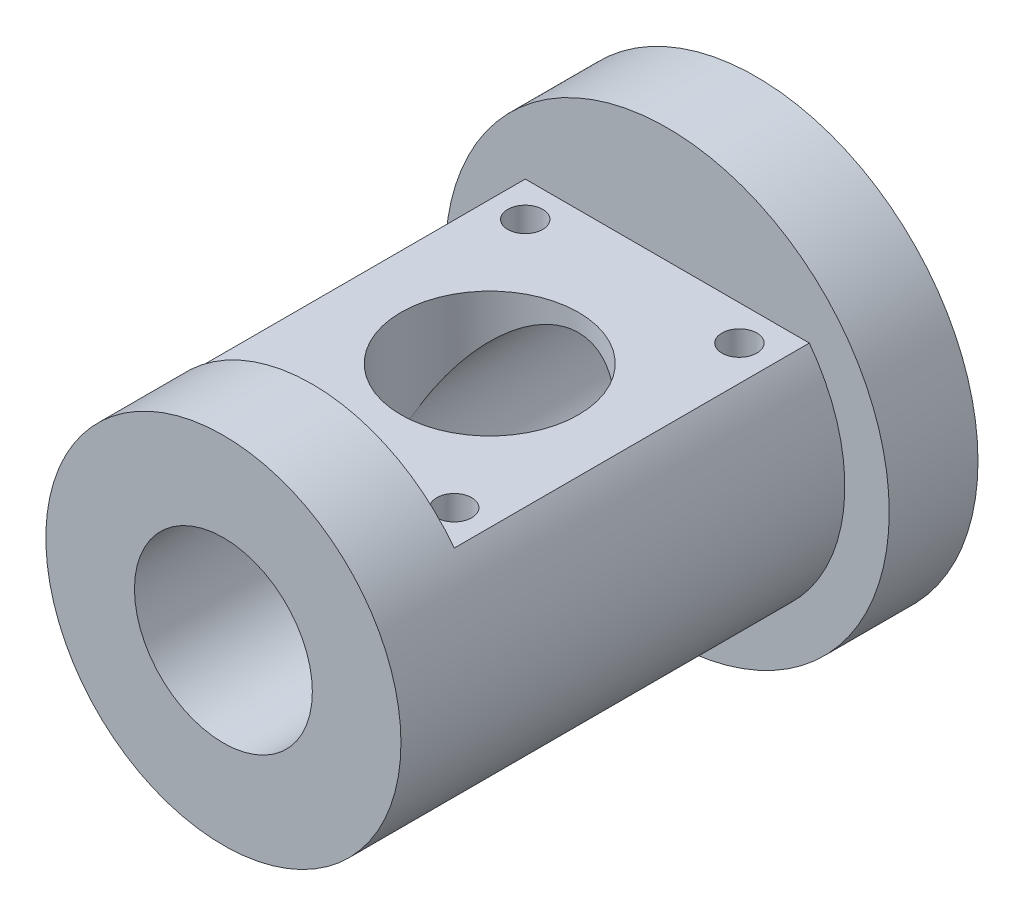
ISO-10303-21;
HEADER;
FILE_DESCRIPTION(('STEP AP214'),'2;1');
FILE_NAME('part.step','',(''),(''),'','','');
FILE_SCHEMA(('AUTOMOTIVE_DESIGN { 1 0 10303 214 1 1 1 1 }'));
ENDSEC;
DATA;
#1=APPLICATION_CONTEXT('core data for automotive mechanical design processes');
#2=APPLICATION_PROTOCOL_DEFINITION('international standard','automotive_design',2000,#1);
#3=PRODUCT_CONTEXT('',#1,'mechanical');
#4=PRODUCT('Part','Part','',(#3));
#5=PRODUCT_RELATED_PRODUCT_CATEGORY('part','',(#4));
#6=PRODUCT_DEFINITION_FORMATION('','',#4);
#7=PRODUCT_DEFINITION_CONTEXT('part definition',#1,'design');
#8=PRODUCT_DEFINITION('design','',#6,#7);
#9=PRODUCT_DEFINITION_SHAPE('','',#8);
#10=(LENGTH_UNIT() NAMED_UNIT(*) SI_UNIT(.MILLI.,.METRE.));
#11=(NAMED_UNIT(*) PLANE_ANGLE_UNIT() SI_UNIT($,.RADIAN.));
#12=(NAMED_UNIT(*) SI_UNIT($,.STERADIAN.) SOLID_ANGLE_UNIT());
#13=UNCERTAINTY_MEASURE_WITH_UNIT(LENGTH_MEASURE(1.E-05),#10,'distance_accuracy_value','');
#14=(GEOMETRIC_REPRESENTATION_CONTEXT(3) GLOBAL_UNCERTAINTY_ASSIGNED_CONTEXT((#13)) GLOBAL_UNIT_ASSIGNED_CONTEXT((#10,
#11,#12)) REPRESENTATION_CONTEXT('',''));
#15=CARTESIAN_POINT('',(0.,0.,0.));
#16=DIRECTION('',(0.,0.,1.));
#17=DIRECTION('',(1.,0.,0.));
#18=AXIS2_PLACEMENT_3D('',#15,#16,#17);
#19=CARTESIAN_POINT('',(0.,0.,76.2));
#20=DIRECTION('',(0.,0.,-1.));
#21=DIRECTION('',(-1.,0.,0.));
#22=AXIS2_PLACEMENT_3D('',#19,#20,#21);
#23=CYLINDRICAL_SURFACE('',#22,25.4);
#24=CARTESIAN_POINT('',(0.,0.,76.2));
#25=DIRECTION('',(0.,0.,1.));
#26=DIRECTION('',(1.,0.,0.));
#27=AXIS2_PLACEMENT_3D('',#24,#25,#26);
#28=CIRCLE('',#27,25.4);
#29=CARTESIAN_POINT('',(25.4,0.,76.2));
#30=VERTEX_POINT('',#29);
#31=EDGE_CURVE('E220',#30,#30,#28,.T.);
#32=ORIENTED_EDGE('',*,*,#31,.F.);
#33=EDGE_LOOP('',(#32));
#34=FACE_BOUND('',#33,.T.);
#35=DIRECTION('',(0.,0.,-1.));
#36=VECTOR('',#35,1.);
#37=CARTESIAN_POINT('',(20.32,15.24,76.2));
#38=LINE('',#37,#36);
#39=CARTESIAN_POINT('',(20.32,15.24,12.7000000000001));
#40=VERTEX_POINT('',#39);
#41=CARTESIAN_POINT('',(20.32,15.24,63.4999999999999));
#42=VERTEX_POINT('',#41);
#43=EDGE_CURVE('E81',#40,#42,#38,.F.);
#44=ORIENTED_EDGE('',*,*,#43,.T.);
#45=CARTESIAN_POINT('',(0.,0.,63.4999999999999));
#46=DIRECTION('',(0.,0.,1.));
#47=DIRECTION('',(1.,0.,0.));
#48=AXIS2_PLACEMENT_3D('',#45,#46,#47);
#49=CIRCLE('',#48,25.4);
#50=CARTESIAN_POINT('',(-20.32,15.24,63.4999999999999));
#51=VERTEX_POINT('',#50);
#52=EDGE_CURVE('E13',#42,#51,#49,.T.);
#53=ORIENTED_EDGE('',*,*,#52,.T.);
#54=DIRECTION('',(0.,0.,-1.));
#55=VECTOR('',#54,1.);
#56=CARTESIAN_POINT('',(-20.32,15.24,76.2));
#57=LINE('',#56,#55);
#58=CARTESIAN_POINT('',(-20.32,15.24,12.7000000000001));
#59=VERTEX_POINT('',#58);
#60=EDGE_CURVE('E73',#51,#59,#57,.T.);
#61=ORIENTED_EDGE('',*,*,#60,.T.);
#62=CARTESIAN_POINT('',(0.,0.,12.7));
#63=DIRECTION('',(0.,0.,-1.));
#64=DIRECTION('',(-1.,0.,0.));
#65=AXIS2_PLACEMENT_3D('',#62,#63,#64);
#66=CIRCLE('',#65,25.4);
#67=EDGE_CURVE('E56',#40,#59,#66,.T.);
#68=ORIENTED_EDGE('',*,*,#67,.F.);
#69=EDGE_LOOP('',(#44,#53,#61,#68));
#70=FACE_BOUND('',#69,.T.);
#71=ADVANCED_FACE('F48',(#34,#70),#23,.T.);
#72=CARTESIAN_POINT('',(0.,0.,76.2));
#73=DIRECTION('',(0.,0.,-1.));
#74=DIRECTION('',(-1.,0.,0.));
#75=AXIS2_PLACEMENT_3D('',#72,#73,#74);
#76=CYLINDRICAL_SURFACE('',#75,12.7254);
#77=CARTESIAN_POINT('',(0.,0.,76.2));
#78=DIRECTION('',(0.,0.,1.));
#79=DIRECTION('',(1.,0.,0.));
#80=AXIS2_PLACEMENT_3D('',#77,#78,#79);
#81=CIRCLE('',#80,12.7254);
#82=CARTESIAN_POINT('',(12.7254,0.,76.2));
#83=VERTEX_POINT('',#82);
#84=EDGE_CURVE('E223',#83,#83,#81,.T.);
#85=ORIENTED_EDGE('',*,*,#84,.T.);
#86=EDGE_LOOP('',(#85));
#87=FACE_BOUND('',#86,.T.);
#88=CARTESIAN_POINT('',(0.,0.,0.));
#89=DIRECTION('',(0.,0.,1.));
#90=DIRECTION('',(1.,0.,0.));
#91=AXIS2_PLACEMENT_3D('',#88,#89,#90);
#92=CIRCLE('',#91,12.7254);
#93=CARTESIAN_POINT('',(12.7254,0.,0.));
#94=VERTEX_POINT('',#93);
#95=EDGE_CURVE('E226',#94,#94,#92,.T.);
#96=ORIENTED_EDGE('',*,*,#95,.F.);
#97=EDGE_LOOP('',(#96));
#98=FACE_BOUND('',#97,.T.);
#99=CARTESIAN_POINT('',(0.,12.7254,25.4));
#100=CARTESIAN_POINT('',(0.283503075217503,12.7253982735124,25.4000017269695));
#101=CARTESIAN_POINT('',(0.567031583878415,12.7159066586084,25.4095122847607));
#102=CARTESIAN_POINT('',(1.13158187092593,12.6781464440053,25.4473483608033));
#103=CARTESIAN_POINT('',(1.41260333746254,12.6498755404723,25.4756761875479));
#104=CARTESIAN_POINT('',(1.96992789090204,12.5751458305134,25.5505580527036));
#105=CARTESIAN_POINT('',(2.24622780434996,12.5286752575441,25.5971238824429));
#106=CARTESIAN_POINT('',(2.79181837703421,12.4184951494227,25.7075333668689));
#107=CARTESIAN_POINT('',(3.06110907436359,12.3547857079802,25.7713769276347));
#108=CARTESIAN_POINT('',(3.58915925229374,12.211800441902,25.9146692007291));
#109=CARTESIAN_POINT('',(3.84797742891022,12.1326323071431,25.9940099560901));
#110=CARTESIAN_POINT('',(4.35565078473388,11.9597670082414,26.167261206221));
#111=CARTESIAN_POINT('',(4.60450617664447,11.8660701544921,26.2611713897276));
#112=CARTESIAN_POINT('',(5.09132901837167,11.6654831413864,26.4622279218859));
#113=CARTESIAN_POINT('',(5.32929490840019,11.5585911000383,26.5693761586451));
#114=CARTESIAN_POINT('',(5.79368760178478,11.3329462168841,26.7955792805922));
#115=CARTESIAN_POINT('',(6.0201116969907,11.214190610599,26.9146369409536));
#116=CARTESIAN_POINT('',(6.5512105600019,10.9153319753728,27.214283268275));
#117=CARTESIAN_POINT('',(6.85000736184145,10.7300054291769,27.4001200068268));
#118=CARTESIAN_POINT('',(7.42342907541239,10.3415923501045,27.7896678968642));
#119=CARTESIAN_POINT('',(7.6980455550405,10.1384996706951,27.9933852345668));
#120=CARTESIAN_POINT('',(8.22368877972578,9.7170183744352,28.4162540764933));
#121=CARTESIAN_POINT('',(8.47466848948848,9.49860070801112,28.635434897413));
#122=CARTESIAN_POINT('',(8.95285712117012,9.04929868062149,29.0864334034598));
#123=CARTESIAN_POINT('',(9.18006601137517,8.81841430302406,29.3182511054457));
#124=CARTESIAN_POINT('',(9.69471784883543,8.25498702554692,29.8841640748558));
#125=CARTESIAN_POINT('',(9.97151962476572,7.91763026258839,30.2231730605859));
#126=CARTESIAN_POINT('',(10.4825681019403,7.22745197465379,30.9172686672075));
#127=CARTESIAN_POINT('',(10.7167945354973,6.87462318301227,31.2723628453862));
#128=CARTESIAN_POINT('',(11.1443228340372,6.15744372921262,31.9950601737473));
#129=CARTESIAN_POINT('',(11.3376316022273,5.79309502251653,32.3626612017366));
#130=CARTESIAN_POINT('',(11.6848642560927,5.0562323878155,33.1077216347447));
#131=CARTESIAN_POINT('',(11.8388063812709,4.68372232833369,33.4851763846333));
#132=CARTESIAN_POINT('',(12.0580267024218,4.07452784431645,34.1052652385187));
#133=CARTESIAN_POINT('',(12.1348991611845,3.83932836596991,34.3453410186967));
#134=CARTESIAN_POINT('',(12.2738783150885,3.36863968249421,34.828167511851));
#135=CARTESIAN_POINT('',(12.3360240586132,3.13315294618359,35.0709093238844));
#136=CARTESIAN_POINT('',(12.4319133450767,2.7231546435206,35.4976261079061));
#137=CARTESIAN_POINT('',(12.4688545321908,2.54847561657312,35.6807268130746));
#138=CARTESIAN_POINT('',(12.5184578287738,2.28734366484906,35.9582487028599));
#139=CARTESIAN_POINT('',(12.5340599812219,2.20020237778568,36.0515021894253));
#140=CARTESIAN_POINT('',(12.5632679719949,2.02677648456196,36.2390055620241));
#141=CARTESIAN_POINT('',(12.576875082303,1.94049136554264,36.3332547717515));
#142=CARTESIAN_POINT('',(12.6021916746324,1.76866194293028,36.5239024562783));
#143=CARTESIAN_POINT('',(12.6138870101864,1.68312723688796,36.6203114348558));
#144=CARTESIAN_POINT('',(12.635276926227,1.51420619273081,36.8156841119073));
#145=CARTESIAN_POINT('',(12.6449664941349,1.43082568212602,36.9146535317131));
#146=CARTESIAN_POINT('',(12.6621883779505,1.26938416159401,37.1155740107605));
#147=CARTESIAN_POINT('',(12.6697384214044,1.19128378212676,37.2174923623163));
#148=CARTESIAN_POINT('',(12.6826500228597,1.04469988257344,37.4280303980356));
#149=CARTESIAN_POINT('',(12.6880233308356,0.976166074864932,37.5366103583696));
#150=CARTESIAN_POINT('',(12.6939919089333,0.893936939290402,37.7057244302322));
#151=CARTESIAN_POINT('',(12.6956103028364,0.870425919367278,37.7612319370542));
#152=CARTESIAN_POINT('',(12.6981362523195,0.832764184171217,37.8751757970996));
#153=CARTESIAN_POINT('',(12.6990483922416,0.818553196669688,37.9335905967143));
#154=CARTESIAN_POINT('',(12.6999522587792,0.804402763331838,38.0408042890113));
#155=CARTESIAN_POINT('',(12.7000870999248,0.802246741481132,38.0892955762355));
#156=CARTESIAN_POINT('',(12.6998015633158,0.806751869208341,38.1859102066779));
#157=CARTESIAN_POINT('',(12.6993803534266,0.813426233557754,38.2340328897962));
#158=CARTESIAN_POINT('',(12.6977680427335,0.838264623438727,38.3470189302518));
#159=CARTESIAN_POINT('',(12.6963404924988,0.859898119017429,38.4110795110424));
#160=CARTESIAN_POINT('',(12.6926862156968,0.912259749449805,38.5354612615749));
#161=CARTESIAN_POINT('',(12.6904550009985,0.94303878587681,38.5957591540054));
#162=CARTESIAN_POINT('',(12.6828969429109,1.04118374100145,38.7687845865987));
#163=CARTESIAN_POINT('',(12.6766356373534,1.11566909245363,38.8772998399882));
#164=CARTESIAN_POINT('',(12.661898891451,1.272193900205,39.0886750743317));
#165=CARTESIAN_POINT('',(12.6534161728792,1.35425760314715,39.1915150944999));
#166=CARTESIAN_POINT('',(12.6342737674974,1.52253890685937,39.3944307584393));
#167=CARTESIAN_POINT('',(12.6236034179358,1.60877520955755,39.4944900274932));
#168=CARTESIAN_POINT('',(12.6001638124911,1.78309555228272,39.6924091662657));
#169=CARTESIAN_POINT('',(12.5873979856684,1.87117637183011,39.7902723371443));
#170=CARTESIAN_POINT('',(12.5460622456827,2.13634637288551,40.0810647174425));
#171=CARTESIAN_POINT('',(12.514372410057,2.31509664377341,40.2720443055038));
#172=CARTESIAN_POINT('',(12.4426290874838,2.67402120678351,40.65109831594));
#173=CARTESIAN_POINT('',(12.4025742284215,2.85419572785466,40.8391722562591));
#174=CARTESIAN_POINT('',(12.3139864475366,3.21497629222656,41.2133168217211));
#175=CARTESIAN_POINT('',(12.2654442255399,3.39558259228463,41.3993850090861));
#176=CARTESIAN_POINT('',(12.159829893858,3.75628463573771,41.7695449095842));
#177=CARTESIAN_POINT('',(12.1027582792705,3.93638040814897,41.9536367367729));
#178=CARTESIAN_POINT('',(11.9188281497951,4.47446424195692,42.5022979300458));
#179=CARTESIAN_POINT('',(11.7790661736377,4.83102319020137,42.864050369837));
#180=CARTESIAN_POINT('',(11.4641354485133,5.53704311691462,43.5786825862194));
#181=CARTESIAN_POINT('',(11.2889797123005,5.88650665224524,43.9315655702677));
#182=CARTESIAN_POINT('',(10.9001572582412,6.57886273380067,44.6297536794355));
#183=CARTESIAN_POINT('',(10.6861556149274,6.92166691794363,44.9749610276522));
#184=CARTESIAN_POINT('',(10.2191156478804,7.59428479322121,45.6517376047582));
#185=CARTESIAN_POINT('',(9.96606636651715,7.92409480519059,45.9833029722226));
#186=CARTESIAN_POINT('',(9.41977234953498,8.56628051614034,46.6285603469664));
#187=CARTESIAN_POINT('',(9.12659082357491,8.87868256556129,46.9422793841533));
#188=CARTESIAN_POINT('',(8.49829876342923,9.48177733960151,47.5476978520094));
#189=CARTESIAN_POINT('',(8.16321706587893,9.77248477730847,47.8394122075289));
#190=CARTESIAN_POINT('',(7.58662245146991,10.2204037948798,48.2887700330917));
#191=CARTESIAN_POINT('',(7.35835221094552,10.3861407530189,48.4550115012856));
#192=CARTESIAN_POINT('',(6.88538804212682,10.70554206866,48.7753442638901));
#193=CARTESIAN_POINT('',(6.64069608947361,10.8592078735912,48.9294370150385));
#194=CARTESIAN_POINT('',(6.13537896805742,11.1524964423885,49.2235105372261));
#195=CARTESIAN_POINT('',(5.87477200854999,11.2921347891677,49.3635069680902));
#196=CARTESIAN_POINT('',(5.3379394424204,11.5555855034477,49.6276119585766));
#197=CARTESIAN_POINT('',(5.06171594570916,11.6794000015334,49.7517226571195));
#198=CARTESIAN_POINT('',(4.53913661289714,11.8911142631278,49.9639300790254));
#199=CARTESIAN_POINT('',(4.2948816904205,11.9816016885515,50.0546227419708));
#200=CARTESIAN_POINT('',(3.79696960554564,12.148569534534,50.2219622030627));
#201=CARTESIAN_POINT('',(3.54331426947897,12.225052658901,50.2986117125202));
#202=CARTESIAN_POINT('',(3.02791501608873,12.3627932482251,50.4366475222624));
#203=CARTESIAN_POINT('',(2.76617376542742,12.4240556738171,50.4980387954182));
#204=CARTESIAN_POINT('',(2.23612450188734,12.5303073251625,50.604511516645));
#205=CARTESIAN_POINT('',(1.96781643482729,12.5752964166001,50.6495928300978));
#206=CARTESIAN_POINT('',(1.4251980506364,12.6483170264759,50.7227621349421));
#207=CARTESIAN_POINT('',(1.15086435833772,12.676262256035,50.7507636556109));
#208=CARTESIAN_POINT('',(0.599713704816765,12.7142615094336,50.7888392703393));
#209=CARTESIAN_POINT('',(0.3228967383441,12.7243154954367,50.7989133264859));
#210=CARTESIAN_POINT('',(-0.230829579139542,12.7263179795671,50.8009198154658));
#211=CARTESIAN_POINT('',(-0.507738912411422,12.718268945767,50.7928547212977));
#212=CARTESIAN_POINT('',(-1.05932638827814,12.6842413038889,50.7587587647089));
#213=CARTESIAN_POINT('',(-1.33400462331233,12.6582634425155,50.7327286505001));
#214=CARTESIAN_POINT('',(-1.85668521513405,12.5917507173774,50.666080735556));
#215=CARTESIAN_POINT('',(-2.10503747298518,12.5525744907347,50.6268244191294));
#216=CARTESIAN_POINT('',(-2.59642790698065,12.4602111182584,50.5342697732623));
#217=CARTESIAN_POINT('',(-2.8394665493885,12.4070252071455,50.4809726812825));
#218=CARTESIAN_POINT('',(-3.31897715797931,12.2874436422606,50.3611370317289));
#219=CARTESIAN_POINT('',(-3.55544774933242,12.221045246236,50.2945957253162));
#220=CARTESIAN_POINT('',(-4.02072679493476,12.075966914226,50.1491989299276));
#221=CARTESIAN_POINT('',(-4.24953377041495,11.9972846243377,50.0703410807912));
#222=CARTESIAN_POINT('',(-4.77138728164633,11.801291398918,49.8739004018208));
#223=CARTESIAN_POINT('',(-5.06123992673702,11.6797228096465,49.7520471327658));
#224=CARTESIAN_POINT('',(-5.62468243252594,11.4190711850423,49.4907622308708));
#225=CARTESIAN_POINT('',(-5.89826804486557,11.2799836037032,49.3513260354233));
#226=CARTESIAN_POINT('',(-6.42873245427022,10.9863200743392,49.0568944885944));
#227=CARTESIAN_POINT('',(-6.68558903799763,10.8317241986041,48.901879117937));
#228=CARTESIAN_POINT('',(-7.18187685388694,10.5092366602926,48.5784730816961));
#229=CARTESIAN_POINT('',(-7.42130716414225,10.3413442952683,48.4100817094626));
#230=CARTESIAN_POINT('',(-7.96597845457128,9.93143306393022,47.99888429144));
#231=CARTESIAN_POINT('',(-8.26382102197971,9.68451388704073,47.7511389045923));
#232=CARTESIAN_POINT('',(-8.82782829027731,9.17334241971672,47.2381006714978));
#233=CARTESIAN_POINT('',(-9.09398201052793,8.90908416996058,46.972801791969));
#234=CARTESIAN_POINT('',(-9.59594516456664,8.36603791991254,46.4273907245614));
#235=CARTESIAN_POINT('',(-9.8316967272197,8.087223588136,46.1472516768294));
#236=CARTESIAN_POINT('',(-10.2732942392052,7.51830616766651,45.5752912297833));
#237=CARTESIAN_POINT('',(-10.4791404026717,7.22820315982364,45.2834699141376));
#238=CARTESIAN_POINT('',(-10.9314339630109,6.53212831494173,44.5826815854777));
#239=CARTESIAN_POINT('',(-11.1655722690426,6.12225587453933,44.1695769072696));
#240=CARTESIAN_POINT('',(-11.4784123713883,5.49872411556746,43.5397620081392));
#241=CARTESIAN_POINT('',(-11.5763249392687,5.28935276681995,43.328056097792));
#242=CARTESIAN_POINT('',(-11.7596228688783,4.86824343240146,42.9015769914166));
#243=CARTESIAN_POINT('',(-11.8450087923617,4.65650555331548,42.6868039334082));
#244=CARTESIAN_POINT('',(-12.0032998719442,4.23176732255097,42.254944981861));
#245=CARTESIAN_POINT('',(-12.0762320675568,4.0187707722341,42.0378652147415));
#246=CARTESIAN_POINT('',(-12.2100488987021,3.59173364965076,41.6009893291556));
#247=CARTESIAN_POINT('',(-12.2709323643066,3.37769297806599,41.3811929491062));
#248=CARTESIAN_POINT('',(-12.3807855614068,2.94970964353661,40.9386766022907));
#249=CARTESIAN_POINT('',(-12.4297583264222,2.73576696951732,40.7159573951976));
#250=CARTESIAN_POINT('',(-12.5159211804403,2.30965617555279,40.2666228529354));
#251=CARTESIAN_POINT('',(-12.5531143372513,2.09748760760766,40.0400085484166));
#252=CARTESIAN_POINT('',(-12.6006308425488,1.78098267962673,39.6901294923564));
#253=CARTESIAN_POINT('',(-12.6152573064685,1.6740411613819,39.5697911674991));
#254=CARTESIAN_POINT('',(-12.6413350785041,1.46407323717637,39.3254900651843));
#255=CARTESIAN_POINT('',(-12.6527893230182,1.36104328719562,39.2015307578467));
#256=CARTESIAN_POINT('',(-12.6683755269201,1.20477722919609,38.9988293192608));
#257=CARTESIAN_POINT('',(-12.6735794732673,1.14852315053622,38.9225126414798));
#258=CARTESIAN_POINT('',(-12.682789932327,1.04185380406188,38.7656172484729));
#259=CARTESIAN_POINT('',(-12.686796400563,0.991438753162282,38.6850383750719));
#260=CARTESIAN_POINT('',(-12.6921552387412,0.919660368212738,38.5493023224672));
#261=CARTESIAN_POINT('',(-12.6939368167992,0.894556452710382,38.4961940071092));
#262=CARTESIAN_POINT('',(-12.6968728378033,0.851870126447791,38.387022786461));
#263=CARTESIAN_POINT('',(-12.6980291333091,0.834265530297703,38.3309691549154));
#264=CARTESIAN_POINT('',(-12.6994449152297,0.812408243813588,38.2274112034527));
#265=CARTESIAN_POINT('',(-12.6998339691585,0.806240878289567,38.1803319443149));
#266=CARTESIAN_POINT('',(-12.7000796923722,0.802363056819035,38.0858949645333));
#267=CARTESIAN_POINT('',(-12.699937391235,0.804636246017999,38.0385379597433));
#268=CARTESIAN_POINT('',(-12.6990455598978,0.818596806274729,37.933891080325));
#269=CARTESIAN_POINT('',(-12.6981606703461,0.832378990769851,37.876894158931));
#270=CARTESIAN_POINT('',(-12.6957213255317,0.868790546310741,37.7656495764018));
#271=CARTESIAN_POINT('',(-12.6941628382066,0.891473117272873,37.7114207054224));
#272=CARTESIAN_POINT('',(-12.6886932472706,0.967122743820459,37.554045187962));
#273=CARTESIAN_POINT('',(-12.6839715883906,1.02801989374566,37.4548960239521));
#274=CARTESIAN_POINT('',(-12.6727234747594,1.15858417553525,37.2625335254469));
#275=CARTESIAN_POINT('',(-12.6661883798605,1.22829239983979,37.169351303934));
#276=CARTESIAN_POINT('',(-12.6513490544642,1.37276879543249,36.9855817861409));
#277=CARTESIAN_POINT('',(-12.64302756324,1.44758109301365,36.8950303659019));
#278=CARTESIAN_POINT('',(-12.6247221652512,1.59939186366176,36.7163746912599));
#279=CARTESIAN_POINT('',(-12.6147423195919,1.67638462402622,36.6282650576188));
#280=CARTESIAN_POINT('',(-12.5826260421702,1.90713004009198,36.3686126737063));
#281=CARTESIAN_POINT('',(-12.5580930470455,2.06284402174891,36.1991063664595));
#282=CARTESIAN_POINT('',(-12.5025867614062,2.37624915345355,35.862980209469));
#283=CARTESIAN_POINT('',(-12.4716122155551,2.53394068325082,35.6963609292191));
#284=CARTESIAN_POINT('',(-12.4031439667533,2.8502700791444,35.3649130673059));
#285=CARTESIAN_POINT('',(-12.3656412264923,3.00890895877292,35.2000873090917));
#286=CARTESIAN_POINT('',(-12.2841019637976,3.32618230426962,34.8720941006063));
#287=CARTESIAN_POINT('',(-12.2400659349102,3.48481676956667,34.7089265260643));
#288=CARTESIAN_POINT('',(-12.0986426342027,3.9581067199435,34.2236639845684));
#289=CARTESIAN_POINT('',(-11.9915123016658,4.27214292661769,33.9037386138866));
#290=CARTESIAN_POINT('',(-11.7506254110194,4.89596033548371,33.2701383586729));
#291=CARTESIAN_POINT('',(-11.616881025093,5.20574341389784,32.9564606885819));
#292=CARTESIAN_POINT('',(-11.3211149184249,5.82111318397531,32.3344446681256));
#293=CARTESIAN_POINT('',(-11.1589364577743,6.12666591897702,32.0261469114347));
#294=CARTESIAN_POINT('',(-10.8058725861039,6.72986488501374,31.4181812651292));
#295=CARTESIAN_POINT('',(-10.6149818009314,7.02750962359289,31.1185150036293));
#296=CARTESIAN_POINT('',(-10.2032690209524,7.61297033835204,30.5294943121854));
#297=CARTESIAN_POINT('',(-9.98241590689301,7.90077570088769,30.2401510037189));
#298=CARTESIAN_POINT('',(-9.5098722197607,8.46363459246762,29.6745579758794));
#299=CARTESIAN_POINT('',(-9.25818949830713,8.73869134380599,29.3983049474542));
#300=CARTESIAN_POINT('',(-8.77946095625681,9.2166076306294,28.9184747801541));
#301=CARTESIAN_POINT('',(-8.5584275272173,9.42245195821292,28.7118651102871));
#302=CARTESIAN_POINT('',(-8.09608215086896,9.8225611107359,28.3103532822664));
#303=CARTESIAN_POINT('',(-7.85477046947059,10.0168260874593,28.1154509706506));
#304=CARTESIAN_POINT('',(-7.35191049346628,10.3915073781641,27.7396023790111));
#305=CARTESIAN_POINT('',(-7.09038456593196,10.5719385709045,27.5586411038392));
#306=CARTESIAN_POINT('',(-6.54696585646184,10.9168002039709,27.2128108003395));
#307=CARTESIAN_POINT('',(-6.26507957784482,11.0812357144546,27.0479366728114));
#308=CARTESIAN_POINT('',(-5.73829800997159,11.3612749429665,26.7671784990981));
#309=CARTESIAN_POINT('',(-5.49689081364674,11.4801518412724,26.6480070816926));
#310=CARTESIAN_POINT('',(-5.00185892223017,11.7043143952062,26.4233039362142));
#311=CARTESIAN_POINT('',(-4.74824084222974,11.8096072985188,26.3177649345846));
#312=CARTESIAN_POINT('',(-4.22977720214966,12.0050607167997,26.1218648654398));
#313=CARTESIAN_POINT('',(-3.96494009989707,12.0952323857724,26.0314926103098));
#314=CARTESIAN_POINT('',(-3.42517973743326,12.2590146656976,25.8673525034709));
#315=CARTESIAN_POINT('',(-3.1502580410353,12.332627831848,25.7935820898756));
#316=CARTESIAN_POINT('',(-2.63986997139382,12.4508350276368,25.6751257641726));
#317=CARTESIAN_POINT('',(-2.40570329044821,12.498239338232,25.6276229901671));
#318=CARTESIAN_POINT('',(-1.93287025587601,12.5800381191425,25.5456556986213));
#319=CARTESIAN_POINT('',(-1.69420453106564,12.6144343935994,25.5111893729985));
#320=CARTESIAN_POINT('',(-1.21376284588202,12.6696900005532,25.4558217882085));
#321=CARTESIAN_POINT('',(-0.971987139923301,12.6905504332683,25.4349194265374));
#322=CARTESIAN_POINT('',(-0.486814004922121,12.7184070397057,25.4070069237667));
#323=CARTESIAN_POINT('',(-0.243416377200543,12.7254014823661,25.3999985172201));
#324=CARTESIAN_POINT('',(0.,12.7254,25.4));
#325=B_SPLINE_CURVE_WITH_KNOTS('',3,(#99,#100,#101,#102,#103,#104,#105,#106,#107,#108,#109,#110,
#111,#112,#113,#114,#115,#116,#117,#118,#119,#120,#121,#122,#123,#124,#125,#126,#127,#128,#129,
#130,#131,#132,#133,#134,#135,#136,#137,#138,#139,#140,#141,#142,#143,#144,#145,#146,#147,#148,
#149,#150,#151,#152,#153,#154,#155,#156,#157,#158,#159,#160,#161,#162,#163,#164,#165,#166,#167,
#168,#169,#170,#171,#172,#173,#174,#175,#176,#177,#178,#179,#180,#181,#182,#183,#184,#185,#186,
#187,#188,#189,#190,#191,#192,#193,#194,#195,#196,#197,#198,#199,#200,#201,#202,#203,#204,#205,
#206,#207,#208,#209,#210,#211,#212,#213,#214,#215,#216,#217,#218,#219,#220,#221,#222,#223,#224,
#225,#226,#227,#228,#229,#230,#231,#232,#233,#234,#235,#236,#237,#238,#239,#240,#241,#242,#243,
#244,#245,#246,#247,#248,#249,#250,#251,#252,#253,#254,#255,#256,#257,#258,#259,#260,#261,#262,
#263,#264,#265,#266,#267,#268,#269,#270,#271,#272,#273,#274,#275,#276,#277,#278,#279,#280,#281,
#282,#283,#284,#285,#286,#287,#288,#289,#290,#291,#292,#293,#294,#295,#296,#297,#298,#299,#300,
#301,#302,#303,#304,#305,#306,#307,#308,#309,#310,#311,#312,#313,#314,#315,#316,#317,#318,#319,
#320,#321,#322,#323,#324),.UNSPECIFIED.,.T.,.F.,(4,2,2,2,2,2,2,2,2,2,2,2,2,2,2,2,2,2,2,2,2,2,2,
2,2,2,2,2,2,2,2,2,2,2,2,2,2,2,2,2,2,2,2,2,2,2,2,2,2,2,2,2,2,2,2,2,2,2,2,2,2,2,2,2,2,2,2,2,2,2,2,
2,2,2,2,2,2,2,2,2,2,2,2,2,2,2,2,2,2,2,2,2,2,2,2,2,2,2,2,2,2,2,2,2,2,2,2,2,2,2,2,2,4),(0.,
0.850238617712459,1.70058156154875,2.55147518344615,3.40236418001712,4.24752449013905,
5.09266674662855,5.93792968290453,6.7833900460451,7.97469144872915,9.16640664735569,
10.3604452597039,11.5544854650616,13.2098220216419,14.8659445373171,16.5217874259626,
18.1768617274583,19.2108760793714,20.2421172365912,21.0091994078198,21.3949275387387,
21.780408660637,22.1686243702412,22.5577988522306,22.9436475780948,23.3273848203628,
23.5077940257586,23.6870221305142,23.8318320570311,23.9768589385324,24.1785311294884,
24.3813474959829,24.775530832237,25.1710221883739,25.5684891068581,25.9653119744873,
26.7555888479751,27.5459954525481,28.337273649699,29.1285059340975,30.7075952847021,
32.2861051253405,33.8789338386954,35.4722103505974,37.0630056690404,38.6527121308607,
39.6342759066286,40.6157218047105,41.5960650826054,42.5762762238609,43.4029135486536,
44.229391106038,45.0555989486423,45.8818136103975,46.7121772042606,47.5425425541754,
48.3727947032046,49.2030122757607,49.9655808134954,50.7280821659716,51.4907419410599,
52.2535480407282,53.2633967643696,54.2735080757888,55.2849343944483,56.2964141820181,
57.6725962108689,59.0492537271044,60.4284942287543,61.8077248540297,63.6866416471575,
64.6267475275445,65.5668112362273,66.5048071858138,67.4428941699025,68.3807419831412,
69.3183453478667,69.803267805968,70.2877398786658,70.5724939310752,70.8572585584626,
71.0332308114489,71.2086788046513,71.3504385178765,71.4919236936325,71.6667938423606,
71.8427255596126,72.190626164015,72.5402136814659,72.8933446552356,73.245623265933,
73.9398704591236,74.6342530749804,75.3296047176473,76.0249038578532,77.4067960678183,
78.7880577032571,80.1771875970588,81.5665778218351,82.9574222927607,84.3479132799475,
85.4449150410854,86.5419024193889,87.637692894757,88.7331348974123,89.6152271021687,
90.4968467065351,91.3778131061883,92.2586434675671,92.9887297727415,93.7187147818707,
94.4486404490405,95.178657236057),.UNSPECIFIED.);
#326=CARTESIAN_POINT('',(0.,12.7254,25.4));
#327=VERTEX_POINT('',#326);
#328=EDGE_CURVE('E80',#327,#327,#325,.T.);
#329=ORIENTED_EDGE('',*,*,#328,.F.);
#330=EDGE_LOOP('',(#329));
#331=FACE_BOUND('',#330,.T.);
#332=ADVANCED_FACE('F50',(#87,#98,#331),#76,.F.);
#333=CARTESIAN_POINT('',(0.,0.,76.2));
#334=DIRECTION('',(0.,0.,1.));
#335=DIRECTION('',(1.,0.,0.));
#336=AXIS2_PLACEMENT_3D('',#333,#334,#335);
#337=PLANE('',#336);
#338=ORIENTED_EDGE('',*,*,#84,.F.);
#339=EDGE_LOOP('',(#338));
#340=FACE_BOUND('',#339,.T.);
#341=ORIENTED_EDGE('',*,*,#31,.T.);
#342=EDGE_LOOP('',(#341));
#343=FACE_BOUND('',#342,.T.);
#344=ADVANCED_FACE('F196',(#340,#343),#337,.T.);
#345=CARTESIAN_POINT('',(0.,0.,0.));
#346=DIRECTION('',(0.,0.,1.));
#347=DIRECTION('',(1.,0.,0.));
#348=AXIS2_PLACEMENT_3D('',#345,#346,#347);
#349=PLANE('',#348);
#350=CARTESIAN_POINT('',(0.,25.4,0.));
#351=DIRECTION('',(0.,0.,-1.));
#352=DIRECTION('',(-1.,0.,0.));
#353=AXIS2_PLACEMENT_3D('',#350,#351,#352);
#354=CIRCLE('',#353,2.665);
#355=CARTESIAN_POINT('',(-2.665,25.4,0.));
#356=VERTEX_POINT('',#355);
#357=EDGE_CURVE('E244',#356,#356,#354,.T.);
#358=ORIENTED_EDGE('',*,*,#357,.F.);
#359=EDGE_LOOP('',(#358));
#360=FACE_BOUND('',#359,.T.);
#361=CARTESIAN_POINT('',(21.9970452561244,12.6999999999994,0.));
#362=DIRECTION('',(0.,0.,-1.));
#363=DIRECTION('',(-1.,0.,0.));
#364=AXIS2_PLACEMENT_3D('',#361,#362,#363);
#365=CIRCLE('',#364,2.66500000000083);
#366=CARTESIAN_POINT('',(19.3320452561236,12.6999999999994,0.));
#367=VERTEX_POINT('',#366);
#368=EDGE_CURVE('E272',#367,#367,#365,.T.);
#369=ORIENTED_EDGE('',*,*,#368,.F.);
#370=EDGE_LOOP('',(#369));
#371=FACE_BOUND('',#370,.T.);
#372=CARTESIAN_POINT('',(21.9970452561237,-12.7000000000006,0.));
#373=DIRECTION('',(0.,0.,-1.));
#374=DIRECTION('',(-1.,0.,0.));
#375=AXIS2_PLACEMENT_3D('',#372,#373,#374);
#376=CIRCLE('',#375,2.66500000000145);
#377=CARTESIAN_POINT('',(19.3320452561222,-12.7000000000006,0.));
#378=VERTEX_POINT('',#377);
#379=EDGE_CURVE('E247',#378,#378,#376,.T.);
#380=ORIENTED_EDGE('',*,*,#379,.F.);
#381=EDGE_LOOP('',(#380));
#382=FACE_BOUND('',#381,.T.);
#383=CARTESIAN_POINT('',(-1.4432899320127E-12,-25.4,0.));
#384=DIRECTION('',(0.,0.,-1.));
#385=DIRECTION('',(-1.,0.,0.));
#386=AXIS2_PLACEMENT_3D('',#383,#384,#385);
#387=CIRCLE('',#386,2.66500000000154);
#388=CARTESIAN_POINT('',(-2.66500000000299,-25.4,0.));
#389=VERTEX_POINT('',#388);
#390=EDGE_CURVE('E254',#389,#389,#387,.T.);
#391=ORIENTED_EDGE('',*,*,#390,.F.);
#392=EDGE_LOOP('',(#391));
#393=FACE_BOUND('',#392,.T.);
#394=CARTESIAN_POINT('',(-21.9970452561258,-12.6999999999994,0.));
#395=DIRECTION('',(0.,0.,-1.));
#396=DIRECTION('',(-1.,0.,0.));
#397=AXIS2_PLACEMENT_3D('',#394,#395,#396);
#398=CIRCLE('',#397,2.66500000000096);
#399=CARTESIAN_POINT('',(-24.6620452561268,-12.6999999999994,0.));
#400=VERTEX_POINT('',#399);
#401=EDGE_CURVE('E260',#400,#400,#398,.T.);
#402=ORIENTED_EDGE('',*,*,#401,.F.);
#403=EDGE_LOOP('',(#402));
#404=FACE_BOUND('',#403,.T.);
#405=CARTESIAN_POINT('',(-21.9970452561251,12.7000000000006,0.));
#406=DIRECTION('',(0.,0.,-1.));
#407=DIRECTION('',(-1.,0.,0.));
#408=AXIS2_PLACEMENT_3D('',#405,#406,#407);
#409=CIRCLE('',#408,2.66500000000022);
#410=CARTESIAN_POINT('',(-24.6620452561253,12.7000000000006,0.));
#411=VERTEX_POINT('',#410);
#412=EDGE_CURVE('E266',#411,#411,#409,.T.);
#413=ORIENTED_EDGE('',*,*,#412,.F.);
#414=EDGE_LOOP('',(#413));
#415=FACE_BOUND('',#414,.T.);
#416=ORIENTED_EDGE('',*,*,#95,.T.);
#417=EDGE_LOOP('',(#416));
#418=FACE_BOUND('',#417,.T.);
#419=CARTESIAN_POINT('',(0.,0.,0.));
#420=DIRECTION('',(0.,0.,-1.));
#421=DIRECTION('',(-1.,0.,0.));
#422=AXIS2_PLACEMENT_3D('',#419,#420,#421);
#423=CIRCLE('',#422,31.75);
#424=CARTESIAN_POINT('',(-31.75,0.,0.));
#425=VERTEX_POINT('',#424);
#426=EDGE_CURVE('E96',#425,#425,#423,.T.);
#427=ORIENTED_EDGE('',*,*,#426,.T.);
#428=EDGE_LOOP('',(#427));
#429=FACE_BOUND('',#428,.T.);
#430=ADVANCED_FACE('F200',(#360,#371,#382,#393,#404,#415,#418,#429),#349,.F.);
#431=CARTESIAN_POINT('',(0.,0.,12.7));
#432=DIRECTION('',(0.,0.,-1.));
#433=DIRECTION('',(-1.,0.,0.));
#434=AXIS2_PLACEMENT_3D('',#431,#432,#433);
#435=CYLINDRICAL_SURFACE('',#434,31.75);
#436=CARTESIAN_POINT('',(0.,0.,12.7));
#437=DIRECTION('',(0.,0.,-1.));
#438=DIRECTION('',(-1.,0.,0.));
#439=AXIS2_PLACEMENT_3D('',#436,#437,#438);
#440=CIRCLE('',#439,31.75);
#441=CARTESIAN_POINT('',(-31.75,0.,12.7));
#442=VERTEX_POINT('',#441);
#443=EDGE_CURVE('E97',#442,#442,#440,.T.);
#444=ORIENTED_EDGE('',*,*,#443,.T.);
#445=EDGE_LOOP('',(#444));
#446=FACE_BOUND('',#445,.T.);
#447=ORIENTED_EDGE('',*,*,#426,.F.);
#448=EDGE_LOOP('',(#447));
#449=FACE_BOUND('',#448,.T.);
#450=ADVANCED_FACE('F203',(#446,#449),#435,.T.);
#451=CARTESIAN_POINT('',(0.,0.,12.7));
#452=DIRECTION('',(0.,0.,-1.));
#453=DIRECTION('',(-1.,0.,0.));
#454=AXIS2_PLACEMENT_3D('',#451,#452,#453);
#455=PLANE('',#454);
#456=ORIENTED_EDGE('',*,*,#443,.F.);
#457=EDGE_LOOP('',(#456));
#458=FACE_BOUND('',#457,.T.);
#459=ORIENTED_EDGE('',*,*,#67,.T.);
#460=DIRECTION('',(-1.,0.,0.));
#461=VECTOR('',#460,1.);
#462=CARTESIAN_POINT('',(-25.4,15.24,12.7000000000001));
#463=LINE('',#462,#461);
#464=EDGE_CURVE('E68',#40,#59,#463,.T.);
#465=ORIENTED_EDGE('',*,*,#464,.F.);
#466=EDGE_LOOP('',(#459,#465));
#467=FACE_BOUND('',#466,.T.);
#468=ADVANCED_FACE('F209',(#458,#467),#455,.F.);
#469=CARTESIAN_POINT('',(0.,31.751,38.1));
#470=DIRECTION('',(0.,-1.,0.));
#471=DIRECTION('',(0.,0.,-1.));
#472=AXIS2_PLACEMENT_3D('',#469,#470,#471);
#473=CYLINDRICAL_SURFACE('',#472,12.7);
#474=CARTESIAN_POINT('',(0.,15.24,38.1));
#475=DIRECTION('',(0.,-1.,0.));
#476=DIRECTION('',(0.,0.,-1.));
#477=AXIS2_PLACEMENT_3D('',#474,#475,#476);
#478=CIRCLE('',#477,12.7);
#479=CARTESIAN_POINT('',(0.,15.24,25.4));
#480=VERTEX_POINT('',#479);
#481=EDGE_CURVE('E84',#480,#480,#478,.T.);
#482=ORIENTED_EDGE('',*,*,#481,.F.);
#483=EDGE_LOOP('',(#482));
#484=FACE_BOUND('',#483,.T.);
#485=ORIENTED_EDGE('',*,*,#328,.T.);
#486=EDGE_LOOP('',(#485));
#487=FACE_BOUND('',#486,.T.);
#488=ADVANCED_FACE('F99',(#484,#487),#473,.F.);
#489=CARTESIAN_POINT('',(-25.4,15.24,63.4999999999999));
#490=DIRECTION('',(0.,0.,1.));
#491=DIRECTION('',(1.,0.,0.));
#492=AXIS2_PLACEMENT_3D('',#489,#490,#491);
#493=PLANE('',#492);
#494=DIRECTION('',(1.,0.,0.));
#495=VECTOR('',#494,1.);
#496=CARTESIAN_POINT('',(-25.4,15.24,63.4999999999999));
#497=LINE('',#496,#495);
#498=EDGE_CURVE('E75',#51,#42,#497,.T.);
#499=ORIENTED_EDGE('',*,*,#498,.F.);
#500=ORIENTED_EDGE('',*,*,#52,.F.);
#501=EDGE_LOOP('',(#499,#500));
#502=FACE_BOUND('',#501,.T.);
#503=ADVANCED_FACE('F83',(#502),#493,.F.);
#504=CARTESIAN_POINT('',(0.,15.24,0.));
#505=DIRECTION('',(0.,-1.,0.));
#506=DIRECTION('',(0.,0.,-1.));
#507=AXIS2_PLACEMENT_3D('',#504,#505,#506);
#508=PLANE('',#507);
#509=CARTESIAN_POINT('',(15.32,15.24,17.7000000000001));
#510=DIRECTION('',(0.,1.,0.));
#511=DIRECTION('',(0.,0.,-1.));
#512=AXIS2_PLACEMENT_3D('',#509,#510,#511);
#513=CIRCLE('',#512,2.5);
#514=CARTESIAN_POINT('',(15.32,15.24,15.2000000000001));
#515=VERTEX_POINT('',#514);
#516=EDGE_CURVE('E293',#515,#515,#513,.T.);
#517=ORIENTED_EDGE('',*,*,#516,.F.);
#518=EDGE_LOOP('',(#517));
#519=FACE_BOUND('',#518,.T.);
#520=CARTESIAN_POINT('',(-15.32,15.24,58.4999999999999));
#521=DIRECTION('',(0.,1.,0.));
#522=DIRECTION('',(0.,0.,-1.));
#523=AXIS2_PLACEMENT_3D('',#520,#521,#522);
#524=CIRCLE('',#523,2.5);
#525=CARTESIAN_POINT('',(-15.32,15.24,55.9999999999999));
#526=VERTEX_POINT('',#525);
#527=EDGE_CURVE('E286',#526,#526,#524,.T.);
#528=ORIENTED_EDGE('',*,*,#527,.F.);
#529=EDGE_LOOP('',(#528));
#530=FACE_BOUND('',#529,.T.);
#531=CARTESIAN_POINT('',(15.32,15.24,58.4999999999999));
#532=DIRECTION('',(0.,1.,0.));
#533=DIRECTION('',(0.,0.,1.));
#534=AXIS2_PLACEMENT_3D('',#531,#532,#533);
#535=CIRCLE('',#534,2.5);
#536=CARTESIAN_POINT('',(15.32,15.24,60.9999999999999));
#537=VERTEX_POINT('',#536);
#538=EDGE_CURVE('E298',#537,#537,#535,.T.);
#539=ORIENTED_EDGE('',*,*,#538,.F.);
#540=EDGE_LOOP('',(#539));
#541=FACE_BOUND('',#540,.T.);
#542=CARTESIAN_POINT('',(-15.32,15.24,17.7000000000001));
#543=DIRECTION('',(0.,1.,0.));
#544=DIRECTION('',(0.,0.,1.));
#545=AXIS2_PLACEMENT_3D('',#542,#543,#544);
#546=CIRCLE('',#545,2.5);
#547=CARTESIAN_POINT('',(-15.32,15.24,20.2000000000001));
#548=VERTEX_POINT('',#547);
#549=EDGE_CURVE('E280',#548,#548,#546,.T.);
#550=ORIENTED_EDGE('',*,*,#549,.F.);
#551=EDGE_LOOP('',(#550));
#552=FACE_BOUND('',#551,.T.);
#553=ORIENTED_EDGE('',*,*,#481,.T.);
#554=EDGE_LOOP('',(#553));
#555=FACE_BOUND('',#554,.T.);
#556=ORIENTED_EDGE('',*,*,#498,.T.);
#557=ORIENTED_EDGE('',*,*,#43,.F.);
#558=ORIENTED_EDGE('',*,*,#464,.T.);
#559=ORIENTED_EDGE('',*,*,#60,.F.);
#560=EDGE_LOOP('',(#556,#557,#558,#559));
#561=FACE_BOUND('',#560,.T.);
#562=ADVANCED_FACE('F74',(#519,#530,#541,#552,#555,#561),#508,.F.);
#563=CARTESIAN_POINT('',(-21.9970452561251,12.7000000000006,6.34999999999999));
#564=DIRECTION('',(0.,0.,-1.));
#565=DIRECTION('',(-1.,0.,0.));
#566=AXIS2_PLACEMENT_3D('',#563,#564,#565);
#567=CYLINDRICAL_SURFACE('',#566,2.66500000000022);
#568=CARTESIAN_POINT('',(-21.9970452561251,12.7000000000006,6.34999999999999));
#569=DIRECTION('',(0.,0.,-1.));
#570=DIRECTION('',(-1.,0.,0.));
#571=AXIS2_PLACEMENT_3D('',#568,#569,#570);
#572=CIRCLE('',#571,2.66500000000022);
#573=CARTESIAN_POINT('',(-24.6620452561253,12.7000000000006,6.34999999999999));
#574=VERTEX_POINT('',#573);
#575=EDGE_CURVE('E269',#574,#574,#572,.T.);
#576=ORIENTED_EDGE('',*,*,#575,.F.);
#577=EDGE_LOOP('',(#576));
#578=FACE_BOUND('',#577,.T.);
#579=ORIENTED_EDGE('',*,*,#412,.T.);
#580=EDGE_LOOP('',(#579));
#581=FACE_BOUND('',#580,.T.);
#582=ADVANCED_FACE('F108',(#578,#581),#567,.F.);
#583=CARTESIAN_POINT('',(-21.9970452561251,12.7000000000006,6.34999999999999));
#584=DIRECTION('',(0.,0.,-1.));
#585=DIRECTION('',(-1.,0.,0.));
#586=AXIS2_PLACEMENT_3D('',#583,#584,#585);
#587=PLANE('',#586);
#588=ORIENTED_EDGE('',*,*,#575,.T.);
#589=EDGE_LOOP('',(#588));
#590=FACE_BOUND('',#589,.T.);
#591=ADVANCED_FACE('F131',(#590),#587,.T.);
#592=CARTESIAN_POINT('',(-21.9970452561258,-12.6999999999994,6.34999999999999));
#593=DIRECTION('',(0.,0.,-1.));
#594=DIRECTION('',(-1.,0.,0.));
#595=AXIS2_PLACEMENT_3D('',#592,#593,#594);
#596=CYLINDRICAL_SURFACE('',#595,2.66500000000096);
#597=CARTESIAN_POINT('',(-21.9970452561258,-12.6999999999994,6.34999999999999));
#598=DIRECTION('',(0.,0.,-1.));
#599=DIRECTION('',(-1.,0.,0.));
#600=AXIS2_PLACEMENT_3D('',#597,#598,#599);
#601=CIRCLE('',#600,2.66500000000096);
#602=CARTESIAN_POINT('',(-24.6620452561268,-12.6999999999994,6.34999999999999));
#603=VERTEX_POINT('',#602);
#604=EDGE_CURVE('E263',#603,#603,#601,.T.);
#605=ORIENTED_EDGE('',*,*,#604,.F.);
#606=EDGE_LOOP('',(#605));
#607=FACE_BOUND('',#606,.T.);
#608=ORIENTED_EDGE('',*,*,#401,.T.);
#609=EDGE_LOOP('',(#608));
#610=FACE_BOUND('',#609,.T.);
#611=ADVANCED_FACE('F128',(#607,#610),#596,.F.);
#612=CARTESIAN_POINT('',(-21.9970452561258,-12.6999999999994,6.34999999999999));
#613=DIRECTION('',(0.,0.,-1.));
#614=DIRECTION('',(-1.,0.,0.));
#615=AXIS2_PLACEMENT_3D('',#612,#613,#614);
#616=PLANE('',#615);
#617=ORIENTED_EDGE('',*,*,#604,.T.);
#618=EDGE_LOOP('',(#617));
#619=FACE_BOUND('',#618,.T.);
#620=ADVANCED_FACE('F123',(#619),#616,.T.);
#621=CARTESIAN_POINT('',(-1.4432899320127E-12,-25.4,6.34999999999999));
#622=DIRECTION('',(0.,0.,-1.));
#623=DIRECTION('',(-1.,0.,0.));
#624=AXIS2_PLACEMENT_3D('',#621,#622,#623);
#625=CYLINDRICAL_SURFACE('',#624,2.66500000000154);
#626=CARTESIAN_POINT('',(-1.4432899320127E-12,-25.4,6.34999999999999));
#627=DIRECTION('',(0.,0.,-1.));
#628=DIRECTION('',(-1.,0.,0.));
#629=AXIS2_PLACEMENT_3D('',#626,#627,#628);
#630=CIRCLE('',#629,2.66500000000154);
#631=CARTESIAN_POINT('',(-2.66500000000299,-25.4,6.34999999999999));
#632=VERTEX_POINT('',#631);
#633=EDGE_CURVE('E257',#632,#632,#630,.T.);
#634=ORIENTED_EDGE('',*,*,#633,.F.);
#635=EDGE_LOOP('',(#634));
#636=FACE_BOUND('',#635,.T.);
#637=ORIENTED_EDGE('',*,*,#390,.T.);
#638=EDGE_LOOP('',(#637));
#639=FACE_BOUND('',#638,.T.);
#640=ADVANCED_FACE('F120',(#636,#639),#625,.F.);
#641=CARTESIAN_POINT('',(-1.4432899320127E-12,-25.4,6.34999999999999));
#642=DIRECTION('',(0.,0.,-1.));
#643=DIRECTION('',(-1.,0.,0.));
#644=AXIS2_PLACEMENT_3D('',#641,#642,#643);
#645=PLANE('',#644);
#646=ORIENTED_EDGE('',*,*,#633,.T.);
#647=EDGE_LOOP('',(#646));
#648=FACE_BOUND('',#647,.T.);
#649=ADVANCED_FACE('F114',(#648),#645,.T.);
#650=CARTESIAN_POINT('',(21.9970452561237,-12.7000000000006,6.34999999999999));
#651=DIRECTION('',(0.,0.,-1.));
#652=DIRECTION('',(-1.,0.,0.));
#653=AXIS2_PLACEMENT_3D('',#650,#651,#652);
#654=CYLINDRICAL_SURFACE('',#653,2.66500000000145);
#655=CARTESIAN_POINT('',(21.9970452561237,-12.7000000000006,6.34999999999999));
#656=DIRECTION('',(0.,0.,-1.));
#657=DIRECTION('',(-1.,0.,0.));
#658=AXIS2_PLACEMENT_3D('',#655,#656,#657);
#659=CIRCLE('',#658,2.66500000000145);
#660=CARTESIAN_POINT('',(19.3320452561222,-12.7000000000006,6.34999999999999));
#661=VERTEX_POINT('',#660);
#662=EDGE_CURVE('E250',#661,#661,#659,.T.);
#663=ORIENTED_EDGE('',*,*,#662,.F.);
#664=EDGE_LOOP('',(#663));
#665=FACE_BOUND('',#664,.T.);
#666=ORIENTED_EDGE('',*,*,#379,.T.);
#667=EDGE_LOOP('',(#666));
#668=FACE_BOUND('',#667,.T.);
#669=ADVANCED_FACE('F110',(#665,#668),#654,.F.);
#670=CARTESIAN_POINT('',(21.9970452561237,-12.7000000000006,6.34999999999999));
#671=DIRECTION('',(0.,0.,-1.));
#672=DIRECTION('',(-1.,0.,0.));
#673=AXIS2_PLACEMENT_3D('',#670,#671,#672);
#674=PLANE('',#673);
#675=ORIENTED_EDGE('',*,*,#662,.T.);
#676=EDGE_LOOP('',(#675));
#677=FACE_BOUND('',#676,.T.);
#678=ADVANCED_FACE('F113',(#677),#674,.T.);
#679=CARTESIAN_POINT('',(21.9970452561244,12.6999999999994,6.34999999999999));
#680=DIRECTION('',(0.,0.,-1.));
#681=DIRECTION('',(-1.,0.,0.));
#682=AXIS2_PLACEMENT_3D('',#679,#680,#681);
#683=CYLINDRICAL_SURFACE('',#682,2.66500000000083);
#684=CARTESIAN_POINT('',(21.9970452561244,12.6999999999994,6.34999999999999));
#685=DIRECTION('',(0.,0.,-1.));
#686=DIRECTION('',(-1.,0.,0.));
#687=AXIS2_PLACEMENT_3D('',#684,#685,#686);
#688=CIRCLE('',#687,2.66500000000083);
#689=CARTESIAN_POINT('',(19.3320452561236,12.6999999999994,6.34999999999999));
#690=VERTEX_POINT('',#689);
#691=EDGE_CURVE('E251',#690,#690,#688,.T.);
#692=ORIENTED_EDGE('',*,*,#691,.F.);
#693=EDGE_LOOP('',(#692));
#694=FACE_BOUND('',#693,.T.);
#695=ORIENTED_EDGE('',*,*,#368,.T.);
#696=EDGE_LOOP('',(#695));
#697=FACE_BOUND('',#696,.T.);
#698=ADVANCED_FACE('F118',(#694,#697),#683,.F.);
#699=CARTESIAN_POINT('',(21.9970452561244,12.6999999999994,6.34999999999999));
#700=DIRECTION('',(0.,0.,-1.));
#701=DIRECTION('',(-1.,0.,0.));
#702=AXIS2_PLACEMENT_3D('',#699,#700,#701);
#703=PLANE('',#702);
#704=ORIENTED_EDGE('',*,*,#691,.T.);
#705=EDGE_LOOP('',(#704));
#706=FACE_BOUND('',#705,.T.);
#707=ADVANCED_FACE('F144',(#706),#703,.T.);
#708=CARTESIAN_POINT('',(0.,25.4,6.34999999999999));
#709=DIRECTION('',(0.,0.,-1.));
#710=DIRECTION('',(-1.,0.,0.));
#711=AXIS2_PLACEMENT_3D('',#708,#709,#710);
#712=CYLINDRICAL_SURFACE('',#711,2.665);
#713=CARTESIAN_POINT('',(0.,25.4,6.34999999999999));
#714=DIRECTION('',(0.,0.,-1.));
#715=DIRECTION('',(-1.,0.,0.));
#716=AXIS2_PLACEMENT_3D('',#713,#714,#715);
#717=CIRCLE('',#716,2.665);
#718=CARTESIAN_POINT('',(-2.665,25.4,6.34999999999999));
#719=VERTEX_POINT('',#718);
#720=EDGE_CURVE('E242',#719,#719,#717,.T.);
#721=ORIENTED_EDGE('',*,*,#720,.F.);
#722=EDGE_LOOP('',(#721));
#723=FACE_BOUND('',#722,.T.);
#724=ORIENTED_EDGE('',*,*,#357,.T.);
#725=EDGE_LOOP('',(#724));
#726=FACE_BOUND('',#725,.T.);
#727=ADVANCED_FACE('F148',(#723,#726),#712,.F.);
#728=CARTESIAN_POINT('',(0.,25.4,6.34999999999999));
#729=DIRECTION('',(0.,0.,-1.));
#730=DIRECTION('',(-1.,0.,0.));
#731=AXIS2_PLACEMENT_3D('',#728,#729,#730);
#732=PLANE('',#731);
#733=ORIENTED_EDGE('',*,*,#720,.T.);
#734=EDGE_LOOP('',(#733));
#735=FACE_BOUND('',#734,.T.);
#736=ADVANCED_FACE('F152',(#735),#732,.T.);
#737=CARTESIAN_POINT('',(-15.32,8.89000000000001,17.7000000000001));
#738=DIRECTION('',(0.,1.,0.));
#739=DIRECTION('',(0.,0.,1.));
#740=AXIS2_PLACEMENT_3D('',#737,#738,#739);
#741=CYLINDRICAL_SURFACE('',#740,2.5);
#742=CARTESIAN_POINT('',(-15.32,8.89000000000001,17.7000000000001));
#743=DIRECTION('',(0.,1.,0.));
#744=DIRECTION('',(0.,0.,1.));
#745=AXIS2_PLACEMENT_3D('',#742,#743,#744);
#746=CIRCLE('',#745,2.5);
#747=CARTESIAN_POINT('',(-15.32,8.89000000000001,20.2000000000001));
#748=VERTEX_POINT('',#747);
#749=EDGE_CURVE('E275',#748,#748,#746,.T.);
#750=ORIENTED_EDGE('',*,*,#749,.F.);
#751=EDGE_LOOP('',(#750));
#752=FACE_BOUND('',#751,.T.);
#753=ORIENTED_EDGE('',*,*,#549,.T.);
#754=EDGE_LOOP('',(#753));
#755=FACE_BOUND('',#754,.T.);
#756=ADVANCED_FACE('F156',(#752,#755),#741,.F.);
#757=CARTESIAN_POINT('',(-15.32,8.89000000000001,17.7000000000001));
#758=DIRECTION('',(0.,1.,0.));
#759=DIRECTION('',(0.,0.,1.));
#760=AXIS2_PLACEMENT_3D('',#757,#758,#759);
#761=PLANE('',#760);
#762=ORIENTED_EDGE('',*,*,#749,.T.);
#763=EDGE_LOOP('',(#762));
#764=FACE_BOUND('',#763,.T.);
#765=ADVANCED_FACE('F160',(#764),#761,.T.);
#766=CARTESIAN_POINT('',(15.32,8.89000000000001,58.4999999999999));
#767=DIRECTION('',(0.,1.,0.));
#768=DIRECTION('',(0.,0.,1.));
#769=AXIS2_PLACEMENT_3D('',#766,#767,#768);
#770=CYLINDRICAL_SURFACE('',#769,2.5);
#771=CARTESIAN_POINT('',(15.32,8.89000000000001,58.4999999999999));
#772=DIRECTION('',(0.,1.,0.));
#773=DIRECTION('',(0.,0.,1.));
#774=AXIS2_PLACEMENT_3D('',#771,#772,#773);
#775=CIRCLE('',#774,2.5);
#776=CARTESIAN_POINT('',(15.32,8.89000000000001,60.9999999999999));
#777=VERTEX_POINT('',#776);
#778=EDGE_CURVE('E290',#777,#777,#775,.T.);
#779=ORIENTED_EDGE('',*,*,#778,.F.);
#780=EDGE_LOOP('',(#779));
#781=FACE_BOUND('',#780,.T.);
#782=ORIENTED_EDGE('',*,*,#538,.T.);
#783=EDGE_LOOP('',(#782));
#784=FACE_BOUND('',#783,.T.);
#785=ADVANCED_FACE('F164',(#781,#784),#770,.F.);
#786=CARTESIAN_POINT('',(15.32,8.89000000000001,58.4999999999999));
#787=DIRECTION('',(0.,1.,0.));
#788=DIRECTION('',(0.,0.,1.));
#789=AXIS2_PLACEMENT_3D('',#786,#787,#788);
#790=PLANE('',#789);
#791=ORIENTED_EDGE('',*,*,#778,.T.);
#792=EDGE_LOOP('',(#791));
#793=FACE_BOUND('',#792,.T.);
#794=ADVANCED_FACE('F170',(#793),#790,.T.);
#795=CARTESIAN_POINT('',(-15.32,8.89000000000001,58.4999999999999));
#796=DIRECTION('',(0.,1.,0.));
#797=DIRECTION('',(0.,0.,1.));
#798=AXIS2_PLACEMENT_3D('',#795,#796,#797);
#799=CYLINDRICAL_SURFACE('',#798,2.5);
#800=CARTESIAN_POINT('',(-15.32,8.89000000000001,58.4999999999999));
#801=DIRECTION('',(0.,1.,0.));
#802=DIRECTION('',(0.,0.,-1.));
#803=AXIS2_PLACEMENT_3D('',#800,#801,#802);
#804=CIRCLE('',#803,2.5);
#805=CARTESIAN_POINT('',(-15.32,8.89000000000001,55.9999999999999));
#806=VERTEX_POINT('',#805);
#807=EDGE_CURVE('E289',#806,#806,#804,.T.);
#808=ORIENTED_EDGE('',*,*,#807,.F.);
#809=EDGE_LOOP('',(#808));
#810=FACE_BOUND('',#809,.T.);
#811=ORIENTED_EDGE('',*,*,#527,.T.);
#812=EDGE_LOOP('',(#811));
#813=FACE_BOUND('',#812,.T.);
#814=ADVANCED_FACE('F166',(#810,#813),#799,.F.);
#815=CARTESIAN_POINT('',(-15.32,8.89000000000001,58.4999999999999));
#816=DIRECTION('',(0.,-1.,0.));
#817=DIRECTION('',(0.,0.,-1.));
#818=AXIS2_PLACEMENT_3D('',#815,#816,#817);
#819=PLANE('',#818);
#820=ORIENTED_EDGE('',*,*,#807,.T.);
#821=EDGE_LOOP('',(#820));
#822=FACE_BOUND('',#821,.T.);
#823=ADVANCED_FACE('F169',(#822),#819,.F.);
#824=CARTESIAN_POINT('',(15.32,8.89000000000001,17.7000000000001));
#825=DIRECTION('',(0.,1.,0.));
#826=DIRECTION('',(0.,0.,1.));
#827=AXIS2_PLACEMENT_3D('',#824,#825,#826);
#828=CYLINDRICAL_SURFACE('',#827,2.5);
#829=CARTESIAN_POINT('',(15.32,8.89000000000001,17.7000000000001));
#830=DIRECTION('',(0.,1.,0.));
#831=DIRECTION('',(0.,0.,-1.));
#832=AXIS2_PLACEMENT_3D('',#829,#830,#831);
#833=CIRCLE('',#832,2.5);
#834=CARTESIAN_POINT('',(15.32,8.89000000000001,15.2000000000001));
#835=VERTEX_POINT('',#834);
#836=EDGE_CURVE('E283',#835,#835,#833,.T.);
#837=ORIENTED_EDGE('',*,*,#836,.F.);
#838=EDGE_LOOP('',(#837));
#839=FACE_BOUND('',#838,.T.);
#840=ORIENTED_EDGE('',*,*,#516,.T.);
#841=EDGE_LOOP('',(#840));
#842=FACE_BOUND('',#841,.T.);
#843=ADVANCED_FACE('F174',(#839,#842),#828,.F.);
#844=CARTESIAN_POINT('',(15.32,8.89000000000001,17.7000000000001));
#845=DIRECTION('',(0.,-1.,0.));
#846=DIRECTION('',(0.,0.,-1.));
#847=AXIS2_PLACEMENT_3D('',#844,#845,#846);
#848=PLANE('',#847);
#849=ORIENTED_EDGE('',*,*,#836,.T.);
#850=EDGE_LOOP('',(#849));
#851=FACE_BOUND('',#850,.T.);
#852=ADVANCED_FACE('F178',(#851),#848,.F.);
#853=CLOSED_SHELL('',(#71,#332,#344,#430,#450,#468,#488,#503,#562,#582,#591,#611,#620,#640,#649,
#669,#678,#698,#707,#727,#736,#756,#765,#785,#794,#814,#823,#843,#852));
#854=MANIFOLD_SOLID_BREP('B2',#853);
#855=ADVANCED_BREP_SHAPE_REPRESENTATION('',(#18,#854),#14);
#856=SHAPE_DEFINITION_REPRESENTATION(#9,#855);
ENDSEC;
END-ISO-10303-21;
